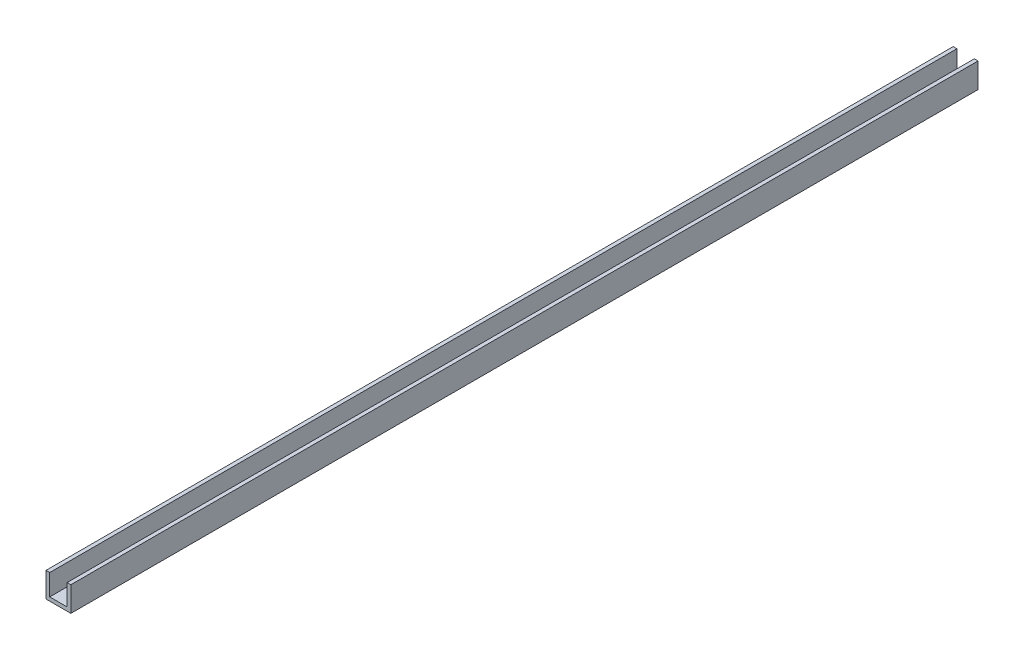
ISO-10303-21;
HEADER;
FILE_DESCRIPTION(('STEP AP214'),'2;1');
FILE_NAME('part.step','',(''),(''),'','','');
FILE_SCHEMA(('AUTOMOTIVE_DESIGN { 1 0 10303 214 1 1 1 1 }'));
ENDSEC;
DATA;
#1=APPLICATION_CONTEXT('core data for automotive mechanical design processes');
#2=APPLICATION_PROTOCOL_DEFINITION('international standard','automotive_design',2000,#1);
#3=PRODUCT_CONTEXT('',#1,'mechanical');
#4=PRODUCT('Part','Part','',(#3));
#5=PRODUCT_RELATED_PRODUCT_CATEGORY('part','',(#4));
#6=PRODUCT_DEFINITION_FORMATION('','',#4);
#7=PRODUCT_DEFINITION_CONTEXT('part definition',#1,'design');
#8=PRODUCT_DEFINITION('design','',#6,#7);
#9=PRODUCT_DEFINITION_SHAPE('','',#8);
#10=(LENGTH_UNIT() NAMED_UNIT(*) SI_UNIT(.MILLI.,.METRE.));
#11=(NAMED_UNIT(*) PLANE_ANGLE_UNIT() SI_UNIT($,.RADIAN.));
#12=(NAMED_UNIT(*) SI_UNIT($,.STERADIAN.) SOLID_ANGLE_UNIT());
#13=UNCERTAINTY_MEASURE_WITH_UNIT(LENGTH_MEASURE(1.E-05),#10,'distance_accuracy_value','');
#14=(GEOMETRIC_REPRESENTATION_CONTEXT(3) GLOBAL_UNCERTAINTY_ASSIGNED_CONTEXT((#13)) GLOBAL_UNIT_ASSIGNED_CONTEXT((#10,
#11,#12)) REPRESENTATION_CONTEXT('',''));
#15=CARTESIAN_POINT('',(0.,0.,0.));
#16=DIRECTION('',(0.,0.,1.));
#17=DIRECTION('',(1.,0.,0.));
#18=AXIS2_PLACEMENT_3D('',#15,#16,#17);
#19=CARTESIAN_POINT('',(0.,10.,365.));
#20=DIRECTION('',(1.,0.,0.));
#21=DIRECTION('',(0.,1.,0.));
#22=AXIS2_PLACEMENT_3D('',#19,#20,#21);
#23=PLANE('',#22);
#24=DIRECTION('',(0.,-1.,0.));
#25=VECTOR('',#24,1.);
#26=CARTESIAN_POINT('',(0.,10.,0.));
#27=LINE('',#26,#25);
#28=CARTESIAN_POINT('',(0.,10.,0.));
#29=VERTEX_POINT('',#28);
#30=CARTESIAN_POINT('',(0.,0.,0.));
#31=VERTEX_POINT('',#30);
#32=EDGE_CURVE('E131',#29,#31,#27,.T.);
#33=ORIENTED_EDGE('',*,*,#32,.T.);
#34=DIRECTION('',(0.,0.,-1.));
#35=VECTOR('',#34,1.);
#36=CARTESIAN_POINT('',(0.,0.,365.));
#37=LINE('',#36,#35);
#38=CARTESIAN_POINT('',(0.,0.,365.));
#39=VERTEX_POINT('',#38);
#40=EDGE_CURVE('E11',#39,#31,#37,.T.);
#41=ORIENTED_EDGE('',*,*,#40,.F.);
#42=DIRECTION('',(0.,-1.,0.));
#43=VECTOR('',#42,1.);
#44=CARTESIAN_POINT('',(0.,10.,365.));
#45=LINE('',#44,#43);
#46=CARTESIAN_POINT('',(0.,10.,365.));
#47=VERTEX_POINT('',#46);
#48=EDGE_CURVE('E145',#47,#39,#45,.T.);
#49=ORIENTED_EDGE('',*,*,#48,.F.);
#50=DIRECTION('',(0.,0.,-1.));
#51=VECTOR('',#50,1.);
#52=CARTESIAN_POINT('',(0.,10.,365.));
#53=LINE('',#52,#51);
#54=EDGE_CURVE('E127',#47,#29,#53,.T.);
#55=ORIENTED_EDGE('',*,*,#54,.T.);
#56=EDGE_LOOP('',(#33,#41,#49,#55));
#57=FACE_BOUND('',#56,.T.);
#58=ADVANCED_FACE('F35',(#57),#23,.F.);
#59=CARTESIAN_POINT('',(0.,0.,365.));
#60=DIRECTION('',(0.,1.,0.));
#61=DIRECTION('',(0.,0.,1.));
#62=AXIS2_PLACEMENT_3D('',#59,#60,#61);
#63=PLANE('',#62);
#64=DIRECTION('',(1.,0.,0.));
#65=VECTOR('',#64,1.);
#66=CARTESIAN_POINT('',(0.,0.,0.));
#67=LINE('',#66,#65);
#68=CARTESIAN_POINT('',(10.,0.,0.));
#69=VERTEX_POINT('',#68);
#70=EDGE_CURVE('E134',#31,#69,#67,.T.);
#71=ORIENTED_EDGE('',*,*,#70,.T.);
#72=DIRECTION('',(0.,0.,-1.));
#73=VECTOR('',#72,1.);
#74=CARTESIAN_POINT('',(10.,0.,365.));
#75=LINE('',#74,#73);
#76=CARTESIAN_POINT('',(10.,0.,365.));
#77=VERTEX_POINT('',#76);
#78=EDGE_CURVE('E43',#77,#69,#75,.T.);
#79=ORIENTED_EDGE('',*,*,#78,.F.);
#80=DIRECTION('',(1.,0.,0.));
#81=VECTOR('',#80,1.);
#82=CARTESIAN_POINT('',(0.,0.,365.));
#83=LINE('',#82,#81);
#84=EDGE_CURVE('E94',#39,#77,#83,.T.);
#85=ORIENTED_EDGE('',*,*,#84,.F.);
#86=ORIENTED_EDGE('',*,*,#40,.T.);
#87=EDGE_LOOP('',(#71,#79,#85,#86));
#88=FACE_BOUND('',#87,.T.);
#89=ADVANCED_FACE('F180',(#88),#63,.F.);
#90=CARTESIAN_POINT('',(10.,0.,365.));
#91=DIRECTION('',(-1.,0.,0.));
#92=DIRECTION('',(0.,0.,1.));
#93=AXIS2_PLACEMENT_3D('',#90,#91,#92);
#94=PLANE('',#93);
#95=DIRECTION('',(0.,1.,0.));
#96=VECTOR('',#95,1.);
#97=CARTESIAN_POINT('',(10.,0.,0.));
#98=LINE('',#97,#96);
#99=CARTESIAN_POINT('',(10.,10.,0.));
#100=VERTEX_POINT('',#99);
#101=EDGE_CURVE('E136',#69,#100,#98,.T.);
#102=ORIENTED_EDGE('',*,*,#101,.T.);
#103=DIRECTION('',(0.,0.,-1.));
#104=VECTOR('',#103,1.);
#105=CARTESIAN_POINT('',(10.,10.,365.));
#106=LINE('',#105,#104);
#107=CARTESIAN_POINT('',(10.,10.,365.));
#108=VERTEX_POINT('',#107);
#109=EDGE_CURVE('E152',#108,#100,#106,.T.);
#110=ORIENTED_EDGE('',*,*,#109,.F.);
#111=DIRECTION('',(0.,1.,0.));
#112=VECTOR('',#111,1.);
#113=CARTESIAN_POINT('',(10.,0.,365.));
#114=LINE('',#113,#112);
#115=EDGE_CURVE('E160',#77,#108,#114,.T.);
#116=ORIENTED_EDGE('',*,*,#115,.F.);
#117=ORIENTED_EDGE('',*,*,#78,.T.);
#118=EDGE_LOOP('',(#102,#110,#116,#117));
#119=FACE_BOUND('',#118,.T.);
#120=ADVANCED_FACE('F158',(#119),#94,.F.);
#121=CARTESIAN_POINT('',(10.,10.,365.));
#122=DIRECTION('',(0.,-1.,0.));
#123=DIRECTION('',(1.,0.,0.));
#124=AXIS2_PLACEMENT_3D('',#121,#122,#123);
#125=PLANE('',#124);
#126=DIRECTION('',(-1.,0.,0.));
#127=VECTOR('',#126,1.);
#128=CARTESIAN_POINT('',(10.,10.,0.));
#129=LINE('',#128,#127);
#130=CARTESIAN_POINT('',(8.5,10.,0.));
#131=VERTEX_POINT('',#130);
#132=EDGE_CURVE('E138',#100,#131,#129,.T.);
#133=ORIENTED_EDGE('',*,*,#132,.T.);
#134=DIRECTION('',(0.,0.,-1.));
#135=VECTOR('',#134,1.);
#136=CARTESIAN_POINT('',(8.5,10.,365.));
#137=LINE('',#136,#135);
#138=CARTESIAN_POINT('',(8.5,10.,365.));
#139=VERTEX_POINT('',#138);
#140=EDGE_CURVE('E149',#139,#131,#137,.T.);
#141=ORIENTED_EDGE('',*,*,#140,.F.);
#142=DIRECTION('',(-1.,0.,0.));
#143=VECTOR('',#142,1.);
#144=CARTESIAN_POINT('',(10.,10.,365.));
#145=LINE('',#144,#143);
#146=EDGE_CURVE('E172',#108,#139,#145,.T.);
#147=ORIENTED_EDGE('',*,*,#146,.F.);
#148=ORIENTED_EDGE('',*,*,#109,.T.);
#149=EDGE_LOOP('',(#133,#141,#147,#148));
#150=FACE_BOUND('',#149,.T.);
#151=ADVANCED_FACE('F168',(#150),#125,.F.);
#152=CARTESIAN_POINT('',(8.5,10.,365.));
#153=DIRECTION('',(1.,0.,0.));
#154=DIRECTION('',(0.,0.,-1.));
#155=AXIS2_PLACEMENT_3D('',#152,#153,#154);
#156=PLANE('',#155);
#157=DIRECTION('',(0.,-1.,0.));
#158=VECTOR('',#157,1.);
#159=CARTESIAN_POINT('',(8.5,10.,0.));
#160=LINE('',#159,#158);
#161=CARTESIAN_POINT('',(8.5,1.5,0.));
#162=VERTEX_POINT('',#161);
#163=EDGE_CURVE('E140',#131,#162,#160,.T.);
#164=ORIENTED_EDGE('',*,*,#163,.T.);
#165=DIRECTION('',(0.,0.,-1.));
#166=VECTOR('',#165,1.);
#167=CARTESIAN_POINT('',(8.5,1.5,365.));
#168=LINE('',#167,#166);
#169=CARTESIAN_POINT('',(8.5,1.5,365.));
#170=VERTEX_POINT('',#169);
#171=EDGE_CURVE('E122',#170,#162,#168,.T.);
#172=ORIENTED_EDGE('',*,*,#171,.F.);
#173=DIRECTION('',(0.,-1.,0.));
#174=VECTOR('',#173,1.);
#175=CARTESIAN_POINT('',(8.5,10.,365.));
#176=LINE('',#175,#174);
#177=EDGE_CURVE('E113',#139,#170,#176,.T.);
#178=ORIENTED_EDGE('',*,*,#177,.F.);
#179=ORIENTED_EDGE('',*,*,#140,.T.);
#180=EDGE_LOOP('',(#164,#172,#178,#179));
#181=FACE_BOUND('',#180,.T.);
#182=ADVANCED_FACE('F171',(#181),#156,.F.);
#183=CARTESIAN_POINT('',(8.5,1.5,365.));
#184=DIRECTION('',(0.,-1.,0.));
#185=DIRECTION('',(1.,0.,0.));
#186=AXIS2_PLACEMENT_3D('',#183,#184,#185);
#187=PLANE('',#186);
#188=DIRECTION('',(-1.,0.,0.));
#189=VECTOR('',#188,1.);
#190=CARTESIAN_POINT('',(8.5,1.5,0.));
#191=LINE('',#190,#189);
#192=CARTESIAN_POINT('',(1.5,1.5,0.));
#193=VERTEX_POINT('',#192);
#194=EDGE_CURVE('E121',#162,#193,#191,.T.);
#195=ORIENTED_EDGE('',*,*,#194,.T.);
#196=DIRECTION('',(0.,0.,-1.));
#197=VECTOR('',#196,1.);
#198=CARTESIAN_POINT('',(1.5,1.5,365.));
#199=LINE('',#198,#197);
#200=CARTESIAN_POINT('',(1.5,1.5,365.));
#201=VERTEX_POINT('',#200);
#202=EDGE_CURVE('E118',#201,#193,#199,.T.);
#203=ORIENTED_EDGE('',*,*,#202,.F.);
#204=DIRECTION('',(-1.,0.,0.));
#205=VECTOR('',#204,1.);
#206=CARTESIAN_POINT('',(8.5,1.5,365.));
#207=LINE('',#206,#205);
#208=EDGE_CURVE('E107',#170,#201,#207,.T.);
#209=ORIENTED_EDGE('',*,*,#208,.F.);
#210=ORIENTED_EDGE('',*,*,#171,.T.);
#211=EDGE_LOOP('',(#195,#203,#209,#210));
#212=FACE_BOUND('',#211,.T.);
#213=ADVANCED_FACE('F119',(#212),#187,.F.);
#214=CARTESIAN_POINT('',(1.5,1.5,365.));
#215=DIRECTION('',(-1.,0.,0.));
#216=DIRECTION('',(0.,-1.,0.));
#217=AXIS2_PLACEMENT_3D('',#214,#215,#216);
#218=PLANE('',#217);
#219=DIRECTION('',(0.,1.,0.));
#220=VECTOR('',#219,1.);
#221=CARTESIAN_POINT('',(1.5,1.5,0.));
#222=LINE('',#221,#220);
#223=CARTESIAN_POINT('',(1.5,10.,0.));
#224=VERTEX_POINT('',#223);
#225=EDGE_CURVE('E80',#193,#224,#222,.T.);
#226=ORIENTED_EDGE('',*,*,#225,.T.);
#227=DIRECTION('',(0.,0.,-1.));
#228=VECTOR('',#227,1.);
#229=CARTESIAN_POINT('',(1.5,10.,365.));
#230=LINE('',#229,#228);
#231=CARTESIAN_POINT('',(1.5,10.,365.));
#232=VERTEX_POINT('',#231);
#233=EDGE_CURVE('E123',#232,#224,#230,.T.);
#234=ORIENTED_EDGE('',*,*,#233,.F.);
#235=DIRECTION('',(0.,1.,0.));
#236=VECTOR('',#235,1.);
#237=CARTESIAN_POINT('',(1.5,1.5,365.));
#238=LINE('',#237,#236);
#239=EDGE_CURVE('E111',#201,#232,#238,.T.);
#240=ORIENTED_EDGE('',*,*,#239,.F.);
#241=ORIENTED_EDGE('',*,*,#202,.T.);
#242=EDGE_LOOP('',(#226,#234,#240,#241));
#243=FACE_BOUND('',#242,.T.);
#244=ADVANCED_FACE('F125',(#243),#218,.F.);
#245=CARTESIAN_POINT('',(1.5,10.,365.));
#246=DIRECTION('',(0.,-1.,0.));
#247=DIRECTION('',(0.,0.,-1.));
#248=AXIS2_PLACEMENT_3D('',#245,#246,#247);
#249=PLANE('',#248);
#250=DIRECTION('',(-1.,0.,0.));
#251=VECTOR('',#250,1.);
#252=CARTESIAN_POINT('',(1.5,10.,0.));
#253=LINE('',#252,#251);
#254=EDGE_CURVE('E86',#224,#29,#253,.T.);
#255=ORIENTED_EDGE('',*,*,#254,.T.);
#256=ORIENTED_EDGE('',*,*,#54,.F.);
#257=DIRECTION('',(-1.,0.,0.));
#258=VECTOR('',#257,1.);
#259=CARTESIAN_POINT('',(1.5,10.,365.));
#260=LINE('',#259,#258);
#261=EDGE_CURVE('E51',#232,#47,#260,.T.);
#262=ORIENTED_EDGE('',*,*,#261,.F.);
#263=ORIENTED_EDGE('',*,*,#233,.T.);
#264=EDGE_LOOP('',(#255,#256,#262,#263));
#265=FACE_BOUND('',#264,.T.);
#266=ADVANCED_FACE('F196',(#265),#249,.F.);
#267=CARTESIAN_POINT('',(0.,0.,365.));
#268=DIRECTION('',(0.,0.,1.));
#269=DIRECTION('',(1.,0.,0.));
#270=AXIS2_PLACEMENT_3D('',#267,#268,#269);
#271=PLANE('',#270);
#272=ORIENTED_EDGE('',*,*,#48,.T.);
#273=ORIENTED_EDGE('',*,*,#84,.T.);
#274=ORIENTED_EDGE('',*,*,#115,.T.);
#275=ORIENTED_EDGE('',*,*,#146,.T.);
#276=ORIENTED_EDGE('',*,*,#177,.T.);
#277=ORIENTED_EDGE('',*,*,#208,.T.);
#278=ORIENTED_EDGE('',*,*,#239,.T.);
#279=ORIENTED_EDGE('',*,*,#261,.T.);
#280=EDGE_LOOP('',(#272,#273,#274,#275,#276,#277,#278,#279));
#281=FACE_BOUND('',#280,.T.);
#282=ADVANCED_FACE('F109',(#281),#271,.T.);
#283=CARTESIAN_POINT('',(0.,0.,0.));
#284=DIRECTION('',(0.,0.,1.));
#285=DIRECTION('',(1.,0.,0.));
#286=AXIS2_PLACEMENT_3D('',#283,#284,#285);
#287=PLANE('',#286);
#288=ORIENTED_EDGE('',*,*,#32,.F.);
#289=ORIENTED_EDGE('',*,*,#254,.F.);
#290=ORIENTED_EDGE('',*,*,#225,.F.);
#291=ORIENTED_EDGE('',*,*,#194,.F.);
#292=ORIENTED_EDGE('',*,*,#163,.F.);
#293=ORIENTED_EDGE('',*,*,#132,.F.);
#294=ORIENTED_EDGE('',*,*,#101,.F.);
#295=ORIENTED_EDGE('',*,*,#70,.F.);
#296=EDGE_LOOP('',(#288,#289,#290,#291,#292,#293,#294,#295));
#297=FACE_BOUND('',#296,.T.);
#298=ADVANCED_FACE('F164',(#297),#287,.F.);
#299=CLOSED_SHELL('',(#58,#89,#120,#151,#182,#213,#244,#266,#282,#298));
#300=MANIFOLD_SOLID_BREP('B2',#299);
#301=ADVANCED_BREP_SHAPE_REPRESENTATION('',(#18,#300),#14);
#302=SHAPE_DEFINITION_REPRESENTATION(#9,#301);
ENDSEC;
END-ISO-10303-21;
